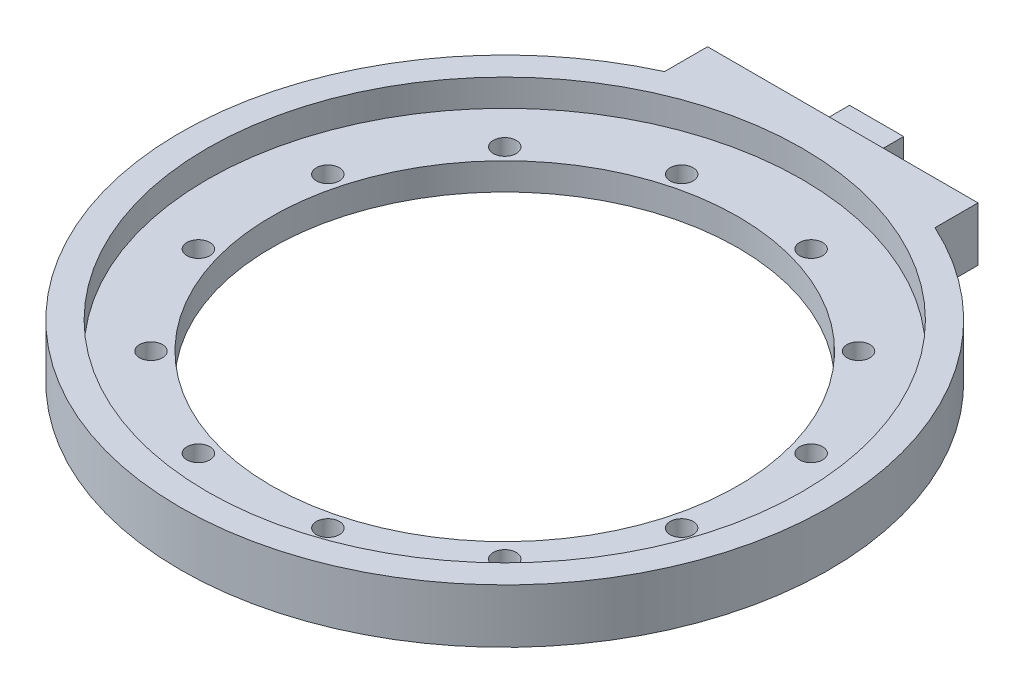
ISO-10303-21;
HEADER;
FILE_DESCRIPTION(('STEP AP214'),'2;1');
FILE_NAME('part.step','',(''),(''),'','','');
FILE_SCHEMA(('AUTOMOTIVE_DESIGN { 1 0 10303 214 1 1 1 1 }'));
ENDSEC;
DATA;
#1=APPLICATION_CONTEXT('core data for automotive mechanical design processes');
#2=APPLICATION_PROTOCOL_DEFINITION('international standard','automotive_design',2000,#1);
#3=PRODUCT_CONTEXT('',#1,'mechanical');
#4=PRODUCT('Part','Part','',(#3));
#5=PRODUCT_RELATED_PRODUCT_CATEGORY('part','',(#4));
#6=PRODUCT_DEFINITION_FORMATION('','',#4);
#7=PRODUCT_DEFINITION_CONTEXT('part definition',#1,'design');
#8=PRODUCT_DEFINITION('design','',#6,#7);
#9=PRODUCT_DEFINITION_SHAPE('','',#8);
#10=(LENGTH_UNIT() NAMED_UNIT(*) SI_UNIT(.MILLI.,.METRE.));
#11=(NAMED_UNIT(*) PLANE_ANGLE_UNIT() SI_UNIT($,.RADIAN.));
#12=(NAMED_UNIT(*) SI_UNIT($,.STERADIAN.) SOLID_ANGLE_UNIT());
#13=UNCERTAINTY_MEASURE_WITH_UNIT(LENGTH_MEASURE(1.E-05),#10,'distance_accuracy_value','');
#14=(GEOMETRIC_REPRESENTATION_CONTEXT(3) GLOBAL_UNCERTAINTY_ASSIGNED_CONTEXT((#13)) GLOBAL_UNIT_ASSIGNED_CONTEXT((#10,
#11,#12)) REPRESENTATION_CONTEXT('',''));
#15=CARTESIAN_POINT('',(0.,0.,0.));
#16=DIRECTION('',(0.,0.,1.));
#17=DIRECTION('',(1.,0.,0.));
#18=AXIS2_PLACEMENT_3D('',#15,#16,#17);
#19=CARTESIAN_POINT('',(0.,26.5,54.9999999999998));
#20=DIRECTION('',(0.,-1.,0.));
#21=DIRECTION('',(0.,0.,-1.));
#22=AXIS2_PLACEMENT_3D('',#19,#20,#21);
#23=CYLINDRICAL_SURFACE('',#22,34.5);
#24=CARTESIAN_POINT('',(0.,8.7,54.9999999999998));
#25=DIRECTION('',(0.,-1.,0.));
#26=DIRECTION('',(0.,0.,-1.));
#27=AXIS2_PLACEMENT_3D('',#24,#25,#26);
#28=CIRCLE('',#27,34.5);
#29=CARTESIAN_POINT('',(0.,8.7,20.4999999999998));
#30=VERTEX_POINT('',#29);
#31=EDGE_CURVE('E171',#30,#30,#28,.T.);
#32=ORIENTED_EDGE('',*,*,#31,.T.);
#33=EDGE_LOOP('',(#32));
#34=FACE_BOUND('',#33,.T.);
#35=CARTESIAN_POINT('',(0.,12.7,54.9999999999998));
#36=DIRECTION('',(0.,1.,0.));
#37=DIRECTION('',(0.,0.,1.));
#38=AXIS2_PLACEMENT_3D('',#35,#36,#37);
#39=CIRCLE('',#38,34.5);
#40=CARTESIAN_POINT('',(0.,12.7,89.4999999999998));
#41=VERTEX_POINT('',#40);
#42=EDGE_CURVE('E257',#41,#41,#39,.F.);
#43=ORIENTED_EDGE('',*,*,#42,.F.);
#44=EDGE_LOOP('',(#43));
#45=FACE_BOUND('',#44,.T.);
#46=ADVANCED_FACE('F33',(#34,#45),#23,.F.);
#47=CARTESIAN_POINT('',(-9.57630466879277,16.7,19.2607444273042));
#48=DIRECTION('',(0.,1.,0.));
#49=DIRECTION('',(0.,0.,1.));
#50=AXIS2_PLACEMENT_3D('',#47,#48,#49);
#51=CYLINDRICAL_SURFACE('',#50,1.69999999999999);
#52=CARTESIAN_POINT('',(-9.57630466879277,8.7,19.2607444273042));
#53=DIRECTION('',(0.,1.,0.));
#54=DIRECTION('',(0.,0.,1.));
#55=AXIS2_PLACEMENT_3D('',#52,#53,#54);
#56=CIRCLE('',#55,1.69999999999999);
#57=CARTESIAN_POINT('',(-9.57630466879277,8.7,20.9607444273042));
#58=VERTEX_POINT('',#57);
#59=EDGE_CURVE('E168',#58,#58,#56,.T.);
#60=ORIENTED_EDGE('',*,*,#59,.F.);
#61=EDGE_LOOP('',(#60));
#62=FACE_BOUND('',#61,.T.);
#63=CARTESIAN_POINT('',(-9.57630466879277,12.7,19.2607444273042));
#64=DIRECTION('',(0.,1.,0.));
#65=DIRECTION('',(0.,0.,1.));
#66=AXIS2_PLACEMENT_3D('',#63,#64,#65);
#67=CIRCLE('',#66,1.69999999999999);
#68=CARTESIAN_POINT('',(-9.57630466879277,12.7,20.9607444273042));
#69=VERTEX_POINT('',#68);
#70=EDGE_CURVE('E254',#69,#69,#67,.F.);
#71=ORIENTED_EDGE('',*,*,#70,.F.);
#72=EDGE_LOOP('',(#71));
#73=FACE_BOUND('',#72,.T.);
#74=ADVANCED_FACE('F333',(#62,#73),#51,.F.);
#75=CARTESIAN_POINT('',(-35.7392555726956,16.7,64.5763046687926));
#76=DIRECTION('',(0.,1.,0.));
#77=DIRECTION('',(0.,0.,1.));
#78=AXIS2_PLACEMENT_3D('',#75,#76,#77);
#79=CYLINDRICAL_SURFACE('',#78,1.69999999999999);
#80=CARTESIAN_POINT('',(-35.7392555726956,8.7,64.5763046687926));
#81=DIRECTION('',(0.,1.,0.));
#82=DIRECTION('',(0.,0.,1.));
#83=AXIS2_PLACEMENT_3D('',#80,#81,#82);
#84=CIRCLE('',#83,1.69999999999999);
#85=CARTESIAN_POINT('',(-35.7392555726956,8.7,66.2763046687926));
#86=VERTEX_POINT('',#85);
#87=EDGE_CURVE('E172',#86,#86,#84,.T.);
#88=ORIENTED_EDGE('',*,*,#87,.F.);
#89=EDGE_LOOP('',(#88));
#90=FACE_BOUND('',#89,.T.);
#91=CARTESIAN_POINT('',(-35.7392555726956,12.7,64.5763046687926));
#92=DIRECTION('',(0.,1.,0.));
#93=DIRECTION('',(0.,0.,1.));
#94=AXIS2_PLACEMENT_3D('',#91,#92,#93);
#95=CIRCLE('',#94,1.69999999999999);
#96=CARTESIAN_POINT('',(-35.7392555726956,12.7,66.2763046687926));
#97=VERTEX_POINT('',#96);
#98=EDGE_CURVE('E251',#97,#97,#95,.F.);
#99=ORIENTED_EDGE('',*,*,#98,.F.);
#100=EDGE_LOOP('',(#99));
#101=FACE_BOUND('',#100,.T.);
#102=ADVANCED_FACE('F338',(#90,#101),#79,.F.);
#103=CARTESIAN_POINT('',(-35.7392555726957,16.7,45.4236953312071));
#104=DIRECTION('',(0.,1.,0.));
#105=DIRECTION('',(0.,0.,1.));
#106=AXIS2_PLACEMENT_3D('',#103,#104,#105);
#107=CYLINDRICAL_SURFACE('',#106,1.69999999999999);
#108=CARTESIAN_POINT('',(-35.7392555726957,8.7,45.4236953312071));
#109=DIRECTION('',(0.,1.,0.));
#110=DIRECTION('',(0.,0.,1.));
#111=AXIS2_PLACEMENT_3D('',#108,#109,#110);
#112=CIRCLE('',#111,1.69999999999999);
#113=CARTESIAN_POINT('',(-35.7392555726957,8.7,47.1236953312071));
#114=VERTEX_POINT('',#113);
#115=EDGE_CURVE('E175',#114,#114,#112,.T.);
#116=ORIENTED_EDGE('',*,*,#115,.F.);
#117=EDGE_LOOP('',(#116));
#118=FACE_BOUND('',#117,.T.);
#119=CARTESIAN_POINT('',(-35.7392555726957,12.7,45.4236953312071));
#120=DIRECTION('',(0.,1.,0.));
#121=DIRECTION('',(0.,0.,1.));
#122=AXIS2_PLACEMENT_3D('',#119,#120,#121);
#123=CIRCLE('',#122,1.69999999999999);
#124=CARTESIAN_POINT('',(-35.7392555726957,12.7,47.1236953312071));
#125=VERTEX_POINT('',#124);
#126=EDGE_CURVE('E248',#125,#125,#123,.F.);
#127=ORIENTED_EDGE('',*,*,#126,.F.);
#128=EDGE_LOOP('',(#127));
#129=FACE_BOUND('',#128,.T.);
#130=ADVANCED_FACE('F345',(#118,#129),#107,.F.);
#131=CARTESIAN_POINT('',(-26.1629509039024,16.7,28.8370490960977));
#132=DIRECTION('',(0.,1.,0.));
#133=DIRECTION('',(0.,0.,1.));
#134=AXIS2_PLACEMENT_3D('',#131,#132,#133);
#135=CYLINDRICAL_SURFACE('',#134,1.69999999999999);
#136=CARTESIAN_POINT('',(-26.1629509039024,8.7,28.8370490960977));
#137=DIRECTION('',(0.,1.,0.));
#138=DIRECTION('',(0.,0.,1.));
#139=AXIS2_PLACEMENT_3D('',#136,#137,#138);
#140=CIRCLE('',#139,1.69999999999999);
#141=CARTESIAN_POINT('',(-26.1629509039024,8.7,30.5370490960977));
#142=VERTEX_POINT('',#141);
#143=EDGE_CURVE('E178',#142,#142,#140,.T.);
#144=ORIENTED_EDGE('',*,*,#143,.F.);
#145=EDGE_LOOP('',(#144));
#146=FACE_BOUND('',#145,.T.);
#147=CARTESIAN_POINT('',(-26.1629509039024,12.7,28.8370490960977));
#148=DIRECTION('',(0.,1.,0.));
#149=DIRECTION('',(0.,0.,1.));
#150=AXIS2_PLACEMENT_3D('',#147,#148,#149);
#151=CIRCLE('',#150,1.69999999999999);
#152=CARTESIAN_POINT('',(-26.1629509039024,12.7,30.5370490960977));
#153=VERTEX_POINT('',#152);
#154=EDGE_CURVE('E245',#153,#153,#151,.F.);
#155=ORIENTED_EDGE('',*,*,#154,.F.);
#156=EDGE_LOOP('',(#155));
#157=FACE_BOUND('',#156,.T.);
#158=ADVANCED_FACE('F349',(#146,#157),#135,.F.);
#159=CARTESIAN_POINT('',(-26.1629509039019,16.7,81.1629509039024));
#160=DIRECTION('',(0.,1.,0.));
#161=DIRECTION('',(0.,0.,1.));
#162=AXIS2_PLACEMENT_3D('',#159,#160,#161);
#163=CYLINDRICAL_SURFACE('',#162,1.69999999999999);
#164=CARTESIAN_POINT('',(-26.1629509039019,8.7,81.1629509039024));
#165=DIRECTION('',(0.,1.,0.));
#166=DIRECTION('',(0.,0.,1.));
#167=AXIS2_PLACEMENT_3D('',#164,#165,#166);
#168=CIRCLE('',#167,1.69999999999999);
#169=CARTESIAN_POINT('',(-26.1629509039019,8.7,82.8629509039024));
#170=VERTEX_POINT('',#169);
#171=EDGE_CURVE('E181',#170,#170,#168,.T.);
#172=ORIENTED_EDGE('',*,*,#171,.F.);
#173=EDGE_LOOP('',(#172));
#174=FACE_BOUND('',#173,.T.);
#175=CARTESIAN_POINT('',(-26.1629509039019,12.7,81.1629509039024));
#176=DIRECTION('',(0.,1.,0.));
#177=DIRECTION('',(0.,0.,1.));
#178=AXIS2_PLACEMENT_3D('',#175,#176,#177);
#179=CIRCLE('',#178,1.69999999999999);
#180=CARTESIAN_POINT('',(-26.1629509039019,12.7,82.8629509039024));
#181=VERTEX_POINT('',#180);
#182=EDGE_CURVE('E242',#181,#181,#179,.F.);
#183=ORIENTED_EDGE('',*,*,#182,.F.);
#184=EDGE_LOOP('',(#183));
#185=FACE_BOUND('',#184,.T.);
#186=ADVANCED_FACE('F353',(#174,#185),#163,.F.);
#187=CARTESIAN_POINT('',(-9.57630466879278,16.7,90.7392555726956));
#188=DIRECTION('',(0.,1.,0.));
#189=DIRECTION('',(0.,0.,1.));
#190=AXIS2_PLACEMENT_3D('',#187,#188,#189);
#191=CYLINDRICAL_SURFACE('',#190,1.69999999999999);
#192=CARTESIAN_POINT('',(-9.57630466879278,8.7,90.7392555726956));
#193=DIRECTION('',(0.,1.,0.));
#194=DIRECTION('',(0.,0.,1.));
#195=AXIS2_PLACEMENT_3D('',#192,#193,#194);
#196=CIRCLE('',#195,1.69999999999999);
#197=CARTESIAN_POINT('',(-9.57630466879278,8.7,92.4392555726955));
#198=VERTEX_POINT('',#197);
#199=EDGE_CURVE('E184',#198,#198,#196,.T.);
#200=ORIENTED_EDGE('',*,*,#199,.F.);
#201=EDGE_LOOP('',(#200));
#202=FACE_BOUND('',#201,.T.);
#203=CARTESIAN_POINT('',(-9.57630466879278,12.7,90.7392555726956));
#204=DIRECTION('',(0.,1.,0.));
#205=DIRECTION('',(0.,0.,1.));
#206=AXIS2_PLACEMENT_3D('',#203,#204,#205);
#207=CIRCLE('',#206,1.69999999999999);
#208=CARTESIAN_POINT('',(-9.57630466879278,12.7,92.4392555726955));
#209=VERTEX_POINT('',#208);
#210=EDGE_CURVE('E239',#209,#209,#207,.F.);
#211=ORIENTED_EDGE('',*,*,#210,.F.);
#212=EDGE_LOOP('',(#211));
#213=FACE_BOUND('',#212,.T.);
#214=ADVANCED_FACE('F357',(#202,#213),#191,.F.);
#215=CARTESIAN_POINT('',(9.57630467,16.7,90.73925557));
#216=DIRECTION('',(0.,1.,0.));
#217=DIRECTION('',(0.,0.,1.));
#218=AXIS2_PLACEMENT_3D('',#215,#216,#217);
#219=CYLINDRICAL_SURFACE('',#218,1.69999999999999);
#220=CARTESIAN_POINT('',(9.57630467,8.7,90.73925557));
#221=DIRECTION('',(0.,1.,0.));
#222=DIRECTION('',(0.,0.,1.));
#223=AXIS2_PLACEMENT_3D('',#220,#221,#222);
#224=CIRCLE('',#223,1.69999999999999);
#225=CARTESIAN_POINT('',(9.57630467,8.7,92.43925557));
#226=VERTEX_POINT('',#225);
#227=EDGE_CURVE('E187',#226,#226,#224,.T.);
#228=ORIENTED_EDGE('',*,*,#227,.F.);
#229=EDGE_LOOP('',(#228));
#230=FACE_BOUND('',#229,.T.);
#231=CARTESIAN_POINT('',(9.57630467,12.7,90.73925557));
#232=DIRECTION('',(0.,1.,0.));
#233=DIRECTION('',(0.,0.,1.));
#234=AXIS2_PLACEMENT_3D('',#231,#232,#233);
#235=CIRCLE('',#234,1.69999999999999);
#236=CARTESIAN_POINT('',(9.57630467,12.7,92.43925557));
#237=VERTEX_POINT('',#236);
#238=EDGE_CURVE('E236',#237,#237,#235,.F.);
#239=ORIENTED_EDGE('',*,*,#238,.F.);
#240=EDGE_LOOP('',(#239));
#241=FACE_BOUND('',#240,.T.);
#242=ADVANCED_FACE('F361',(#230,#241),#219,.F.);
#243=CARTESIAN_POINT('',(26.6193735905557,16.7,81.6193735905552));
#244=DIRECTION('',(0.,1.,0.));
#245=DIRECTION('',(0.,0.,1.));
#246=AXIS2_PLACEMENT_3D('',#243,#244,#245);
#247=CYLINDRICAL_SURFACE('',#246,1.69999999999999);
#248=CARTESIAN_POINT('',(26.6193735905557,8.7,81.6193735905552));
#249=DIRECTION('',(0.,1.,0.));
#250=DIRECTION('',(0.,0.,1.));
#251=AXIS2_PLACEMENT_3D('',#248,#249,#250);
#252=CIRCLE('',#251,1.69999999999999);
#253=CARTESIAN_POINT('',(26.6193735905557,8.7,83.3193735905552));
#254=VERTEX_POINT('',#253);
#255=EDGE_CURVE('E190',#254,#254,#252,.T.);
#256=ORIENTED_EDGE('',*,*,#255,.F.);
#257=EDGE_LOOP('',(#256));
#258=FACE_BOUND('',#257,.T.);
#259=CARTESIAN_POINT('',(26.6193735905557,12.7,81.6193735905552));
#260=DIRECTION('',(0.,1.,0.));
#261=DIRECTION('',(0.,0.,1.));
#262=AXIS2_PLACEMENT_3D('',#259,#260,#261);
#263=CIRCLE('',#262,1.69999999999999);
#264=CARTESIAN_POINT('',(26.6193735905557,12.7,83.3193735905552));
#265=VERTEX_POINT('',#264);
#266=EDGE_CURVE('E233',#265,#265,#263,.F.);
#267=ORIENTED_EDGE('',*,*,#266,.F.);
#268=EDGE_LOOP('',(#267));
#269=FACE_BOUND('',#268,.T.);
#270=ADVANCED_FACE('F365',(#258,#269),#247,.F.);
#271=CARTESIAN_POINT('',(35.7392555726957,16.7,64.5763046687926));
#272=DIRECTION('',(0.,1.,0.));
#273=DIRECTION('',(0.,0.,1.));
#274=AXIS2_PLACEMENT_3D('',#271,#272,#273);
#275=CYLINDRICAL_SURFACE('',#274,1.69999999999999);
#276=CARTESIAN_POINT('',(35.7392555726957,8.7,64.5763046687926));
#277=DIRECTION('',(0.,1.,0.));
#278=DIRECTION('',(0.,0.,1.));
#279=AXIS2_PLACEMENT_3D('',#276,#277,#278);
#280=CIRCLE('',#279,1.69999999999999);
#281=CARTESIAN_POINT('',(35.7392555726957,8.7,66.2763046687926));
#282=VERTEX_POINT('',#281);
#283=EDGE_CURVE('E193',#282,#282,#280,.T.);
#284=ORIENTED_EDGE('',*,*,#283,.F.);
#285=EDGE_LOOP('',(#284));
#286=FACE_BOUND('',#285,.T.);
#287=CARTESIAN_POINT('',(35.7392555726957,12.7,64.5763046687926));
#288=DIRECTION('',(0.,1.,0.));
#289=DIRECTION('',(0.,0.,1.));
#290=AXIS2_PLACEMENT_3D('',#287,#288,#289);
#291=CIRCLE('',#290,1.69999999999999);
#292=CARTESIAN_POINT('',(35.7392555726957,12.7,66.2763046687926));
#293=VERTEX_POINT('',#292);
#294=EDGE_CURVE('E230',#293,#293,#291,.F.);
#295=ORIENTED_EDGE('',*,*,#294,.F.);
#296=EDGE_LOOP('',(#295));
#297=FACE_BOUND('',#296,.T.);
#298=ADVANCED_FACE('F369',(#286,#297),#275,.F.);
#299=CARTESIAN_POINT('',(35.7392555726954,16.7,45.4236953312054));
#300=DIRECTION('',(0.,1.,0.));
#301=DIRECTION('',(0.,0.,1.));
#302=AXIS2_PLACEMENT_3D('',#299,#300,#301);
#303=CYLINDRICAL_SURFACE('',#302,1.69999999999999);
#304=CARTESIAN_POINT('',(35.7392555726954,8.7,45.4236953312054));
#305=DIRECTION('',(0.,1.,0.));
#306=DIRECTION('',(0.,0.,1.));
#307=AXIS2_PLACEMENT_3D('',#304,#305,#306);
#308=CIRCLE('',#307,1.69999999999999);
#309=CARTESIAN_POINT('',(35.7392555726954,8.7,47.1236953312054));
#310=VERTEX_POINT('',#309);
#311=EDGE_CURVE('E196',#310,#310,#308,.T.);
#312=ORIENTED_EDGE('',*,*,#311,.F.);
#313=EDGE_LOOP('',(#312));
#314=FACE_BOUND('',#313,.T.);
#315=CARTESIAN_POINT('',(35.7392555726954,12.7,45.4236953312054));
#316=DIRECTION('',(0.,1.,0.));
#317=DIRECTION('',(0.,0.,1.));
#318=AXIS2_PLACEMENT_3D('',#315,#316,#317);
#319=CIRCLE('',#318,1.69999999999999);
#320=CARTESIAN_POINT('',(35.7392555726954,12.7,47.1236953312054));
#321=VERTEX_POINT('',#320);
#322=EDGE_CURVE('E218',#321,#321,#319,.F.);
#323=ORIENTED_EDGE('',*,*,#322,.F.);
#324=EDGE_LOOP('',(#323));
#325=FACE_BOUND('',#324,.T.);
#326=ADVANCED_FACE('F373',(#314,#325),#303,.F.);
#327=CARTESIAN_POINT('',(26.1629509039016,16.7,28.8370490960969));
#328=DIRECTION('',(0.,1.,0.));
#329=DIRECTION('',(0.,0.,1.));
#330=AXIS2_PLACEMENT_3D('',#327,#328,#329);
#331=CYLINDRICAL_SURFACE('',#330,1.69999999999999);
#332=CARTESIAN_POINT('',(26.1629509039016,8.7,28.8370490960969));
#333=DIRECTION('',(0.,1.,0.));
#334=DIRECTION('',(0.,0.,1.));
#335=AXIS2_PLACEMENT_3D('',#332,#333,#334);
#336=CIRCLE('',#335,1.69999999999999);
#337=CARTESIAN_POINT('',(26.1629509039016,8.7,30.5370490960969));
#338=VERTEX_POINT('',#337);
#339=EDGE_CURVE('E199',#338,#338,#336,.T.);
#340=ORIENTED_EDGE('',*,*,#339,.F.);
#341=EDGE_LOOP('',(#340));
#342=FACE_BOUND('',#341,.T.);
#343=CARTESIAN_POINT('',(26.1629509039016,12.7,28.8370490960969));
#344=DIRECTION('',(0.,1.,0.));
#345=DIRECTION('',(0.,0.,1.));
#346=AXIS2_PLACEMENT_3D('',#343,#344,#345);
#347=CIRCLE('',#346,1.69999999999999);
#348=CARTESIAN_POINT('',(26.1629509039016,12.7,30.5370490960969));
#349=VERTEX_POINT('',#348);
#350=EDGE_CURVE('E215',#349,#349,#347,.F.);
#351=ORIENTED_EDGE('',*,*,#350,.F.);
#352=EDGE_LOOP('',(#351));
#353=FACE_BOUND('',#352,.T.);
#354=ADVANCED_FACE('F210',(#342,#353),#331,.F.);
#355=CARTESIAN_POINT('',(9.57630466879279,16.7,19.2607444273042));
#356=DIRECTION('',(0.,1.,0.));
#357=DIRECTION('',(0.,0.,1.));
#358=AXIS2_PLACEMENT_3D('',#355,#356,#357);
#359=CYLINDRICAL_SURFACE('',#358,1.69999999999999);
#360=CARTESIAN_POINT('',(9.57630466879279,8.7,19.2607444273042));
#361=DIRECTION('',(0.,1.,0.));
#362=DIRECTION('',(0.,0.,1.));
#363=AXIS2_PLACEMENT_3D('',#360,#361,#362);
#364=CIRCLE('',#363,1.69999999999999);
#365=CARTESIAN_POINT('',(9.57630466879279,8.7,20.9607444273042));
#366=VERTEX_POINT('',#365);
#367=EDGE_CURVE('E144',#366,#366,#364,.T.);
#368=ORIENTED_EDGE('',*,*,#367,.F.);
#369=EDGE_LOOP('',(#368));
#370=FACE_BOUND('',#369,.T.);
#371=CARTESIAN_POINT('',(9.57630466879279,12.7,19.2607444273042));
#372=DIRECTION('',(0.,1.,0.));
#373=DIRECTION('',(0.,0.,1.));
#374=AXIS2_PLACEMENT_3D('',#371,#372,#373);
#375=CIRCLE('',#374,1.69999999999999);
#376=CARTESIAN_POINT('',(9.57630466879279,12.7,20.9607444273042));
#377=VERTEX_POINT('',#376);
#378=EDGE_CURVE('E37',#377,#377,#375,.F.);
#379=ORIENTED_EDGE('',*,*,#378,.F.);
#380=EDGE_LOOP('',(#379));
#381=FACE_BOUND('',#380,.T.);
#382=ADVANCED_FACE('F206',(#370,#381),#359,.F.);
#383=CARTESIAN_POINT('',(0.,16.7,55.));
#384=DIRECTION('',(0.,-1.,0.));
#385=DIRECTION('',(0.,0.,-1.));
#386=AXIS2_PLACEMENT_3D('',#383,#384,#385);
#387=CYLINDRICAL_SURFACE('',#386,48.);
#388=CARTESIAN_POINT('',(0.,8.7,55.));
#389=DIRECTION('',(0.,-1.,0.));
#390=DIRECTION('',(0.,0.,1.));
#391=AXIS2_PLACEMENT_3D('',#388,#389,#390);
#392=CIRCLE('',#391,48.);
#393=CARTESIAN_POINT('',(20.,8.7,11.3651515414571));
#394=VERTEX_POINT('',#393);
#395=CARTESIAN_POINT('',(-20.,8.7,11.3651515414571));
#396=VERTEX_POINT('',#395);
#397=EDGE_CURVE('E303',#394,#396,#392,.T.);
#398=ORIENTED_EDGE('',*,*,#397,.F.);
#399=DIRECTION('',(0.,-1.,0.));
#400=VECTOR('',#399,1.);
#401=CARTESIAN_POINT('',(20.,16.7,11.3651515414571));
#402=LINE('',#401,#400);
#403=CARTESIAN_POINT('',(20.,16.7,11.3651515414571));
#404=VERTEX_POINT('',#403);
#405=EDGE_CURVE('E42',#404,#394,#402,.T.);
#406=ORIENTED_EDGE('',*,*,#405,.F.);
#407=CARTESIAN_POINT('',(0.,16.7,55.));
#408=DIRECTION('',(0.,-1.,0.));
#409=DIRECTION('',(0.,0.,1.));
#410=AXIS2_PLACEMENT_3D('',#407,#408,#409);
#411=CIRCLE('',#410,48.);
#412=CARTESIAN_POINT('',(-20.,16.7,11.3651515414571));
#413=VERTEX_POINT('',#412);
#414=EDGE_CURVE('E156',#404,#413,#411,.T.);
#415=ORIENTED_EDGE('',*,*,#414,.T.);
#416=DIRECTION('',(0.,-1.,0.));
#417=VECTOR('',#416,1.);
#418=CARTESIAN_POINT('',(-20.,16.7,11.3651515414571));
#419=LINE('',#418,#417);
#420=EDGE_CURVE('E165',#413,#396,#419,.T.);
#421=ORIENTED_EDGE('',*,*,#420,.T.);
#422=EDGE_LOOP('',(#398,#406,#415,#421));
#423=FACE_BOUND('',#422,.T.);
#424=ADVANCED_FACE('F209',(#423),#387,.T.);
#425=CARTESIAN_POINT('',(0.,16.7,55.));
#426=DIRECTION('',(0.,1.,0.));
#427=DIRECTION('',(0.,0.,1.));
#428=AXIS2_PLACEMENT_3D('',#425,#426,#427);
#429=PLANE('',#428);
#430=CARTESIAN_POINT('',(0.,16.7,54.9999999999998));
#431=DIRECTION('',(0.,1.,0.));
#432=DIRECTION('',(0.,0.,1.));
#433=AXIS2_PLACEMENT_3D('',#430,#431,#432);
#434=CIRCLE('',#433,44.);
#435=CARTESIAN_POINT('',(0.,16.7,98.9999999999998));
#436=VERTEX_POINT('',#435);
#437=EDGE_CURVE('E221',#436,#436,#434,.T.);
#438=ORIENTED_EDGE('',*,*,#437,.F.);
#439=EDGE_LOOP('',(#438));
#440=FACE_BOUND('',#439,.T.);
#441=ORIENTED_EDGE('',*,*,#414,.F.);
#442=DIRECTION('',(0.,0.,1.));
#443=VECTOR('',#442,1.);
#444=CARTESIAN_POINT('',(20.,16.7,5.));
#445=LINE('',#444,#443);
#446=CARTESIAN_POINT('',(20.,16.7,5.));
#447=VERTEX_POINT('',#446);
#448=EDGE_CURVE('E167',#447,#404,#445,.T.);
#449=ORIENTED_EDGE('',*,*,#448,.F.);
#450=DIRECTION('',(1.,0.,0.));
#451=VECTOR('',#450,1.);
#452=CARTESIAN_POINT('',(-20.,16.7,5.));
#453=LINE('',#452,#451);
#454=CARTESIAN_POINT('',(-20.,16.7,5.));
#455=VERTEX_POINT('',#454);
#456=EDGE_CURVE('E11',#455,#447,#453,.T.);
#457=ORIENTED_EDGE('',*,*,#456,.F.);
#458=DIRECTION('',(0.,0.,-1.));
#459=VECTOR('',#458,1.);
#460=CARTESIAN_POINT('',(-20.,16.7,5.));
#461=LINE('',#460,#459);
#462=EDGE_CURVE('E306',#413,#455,#461,.T.);
#463=ORIENTED_EDGE('',*,*,#462,.F.);
#464=EDGE_LOOP('',(#441,#449,#457,#463));
#465=FACE_BOUND('',#464,.T.);
#466=ADVANCED_FACE('F321',(#440,#465),#429,.T.);
#467=CARTESIAN_POINT('',(0.,8.7,55.));
#468=DIRECTION('',(0.,1.,0.));
#469=DIRECTION('',(0.,0.,1.));
#470=AXIS2_PLACEMENT_3D('',#467,#468,#469);
#471=PLANE('',#470);
#472=ORIENTED_EDGE('',*,*,#367,.T.);
#473=EDGE_LOOP('',(#472));
#474=FACE_BOUND('',#473,.T.);
#475=ORIENTED_EDGE('',*,*,#339,.T.);
#476=EDGE_LOOP('',(#475));
#477=FACE_BOUND('',#476,.T.);
#478=ORIENTED_EDGE('',*,*,#311,.T.);
#479=EDGE_LOOP('',(#478));
#480=FACE_BOUND('',#479,.T.);
#481=ORIENTED_EDGE('',*,*,#283,.T.);
#482=EDGE_LOOP('',(#481));
#483=FACE_BOUND('',#482,.T.);
#484=ORIENTED_EDGE('',*,*,#255,.T.);
#485=EDGE_LOOP('',(#484));
#486=FACE_BOUND('',#485,.T.);
#487=ORIENTED_EDGE('',*,*,#227,.T.);
#488=EDGE_LOOP('',(#487));
#489=FACE_BOUND('',#488,.T.);
#490=ORIENTED_EDGE('',*,*,#199,.T.);
#491=EDGE_LOOP('',(#490));
#492=FACE_BOUND('',#491,.T.);
#493=ORIENTED_EDGE('',*,*,#171,.T.);
#494=EDGE_LOOP('',(#493));
#495=FACE_BOUND('',#494,.T.);
#496=ORIENTED_EDGE('',*,*,#143,.T.);
#497=EDGE_LOOP('',(#496));
#498=FACE_BOUND('',#497,.T.);
#499=ORIENTED_EDGE('',*,*,#115,.T.);
#500=EDGE_LOOP('',(#499));
#501=FACE_BOUND('',#500,.T.);
#502=ORIENTED_EDGE('',*,*,#87,.T.);
#503=EDGE_LOOP('',(#502));
#504=FACE_BOUND('',#503,.T.);
#505=ORIENTED_EDGE('',*,*,#59,.T.);
#506=EDGE_LOOP('',(#505));
#507=FACE_BOUND('',#506,.T.);
#508=ORIENTED_EDGE('',*,*,#31,.F.);
#509=EDGE_LOOP('',(#508));
#510=FACE_BOUND('',#509,.T.);
#511=ORIENTED_EDGE('',*,*,#397,.T.);
#512=DIRECTION('',(0.,0.,-1.));
#513=VECTOR('',#512,1.);
#514=CARTESIAN_POINT('',(-20.,8.7,5.));
#515=LINE('',#514,#513);
#516=CARTESIAN_POINT('',(-20.,8.7,5.));
#517=VERTEX_POINT('',#516);
#518=EDGE_CURVE('E151',#396,#517,#515,.T.);
#519=ORIENTED_EDGE('',*,*,#518,.T.);
#520=DIRECTION('',(1.,0.,0.));
#521=VECTOR('',#520,1.);
#522=CARTESIAN_POINT('',(-20.,8.7,5.));
#523=LINE('',#522,#521);
#524=CARTESIAN_POINT('',(-12.,8.7,5.));
#525=VERTEX_POINT('',#524);
#526=EDGE_CURVE('E126',#517,#525,#523,.T.);
#527=ORIENTED_EDGE('',*,*,#526,.T.);
#528=DIRECTION('',(0.,0.,-1.));
#529=VECTOR('',#528,1.);
#530=CARTESIAN_POINT('',(-12.,8.7,5.));
#531=LINE('',#530,#529);
#532=CARTESIAN_POINT('',(-12.,8.7,0.));
#533=VERTEX_POINT('',#532);
#534=EDGE_CURVE('E137',#525,#533,#531,.T.);
#535=ORIENTED_EDGE('',*,*,#534,.T.);
#536=DIRECTION('',(1.,0.,0.));
#537=VECTOR('',#536,1.);
#538=CARTESIAN_POINT('',(12.,8.7,0.));
#539=LINE('',#538,#537);
#540=CARTESIAN_POINT('',(12.,8.7,0.));
#541=VERTEX_POINT('',#540);
#542=EDGE_CURVE('E272',#533,#541,#539,.T.);
#543=ORIENTED_EDGE('',*,*,#542,.T.);
#544=DIRECTION('',(0.,0.,-1.));
#545=VECTOR('',#544,1.);
#546=CARTESIAN_POINT('',(12.,8.7,5.));
#547=LINE('',#546,#545);
#548=CARTESIAN_POINT('',(12.,8.7,5.));
#549=VERTEX_POINT('',#548);
#550=EDGE_CURVE('E145',#549,#541,#547,.T.);
#551=ORIENTED_EDGE('',*,*,#550,.F.);
#552=CARTESIAN_POINT('',(20.,8.7,5.));
#553=VERTEX_POINT('',#552);
#554=EDGE_CURVE('E153',#549,#553,#523,.T.);
#555=ORIENTED_EDGE('',*,*,#554,.T.);
#556=DIRECTION('',(0.,0.,1.));
#557=VECTOR('',#556,1.);
#558=CARTESIAN_POINT('',(20.,8.7,5.));
#559=LINE('',#558,#557);
#560=EDGE_CURVE('E152',#553,#394,#559,.T.);
#561=ORIENTED_EDGE('',*,*,#560,.T.);
#562=EDGE_LOOP('',(#511,#519,#527,#535,#543,#551,#555,#561));
#563=FACE_BOUND('',#562,.T.);
#564=ADVANCED_FACE('F149',(#474,#477,#480,#483,#486,#489,#492,#495,#498,#501,#504,#507,#510,
#563),#471,.F.);
#565=CARTESIAN_POINT('',(-20.,16.7,5.));
#566=DIRECTION('',(-1.,0.,0.));
#567=DIRECTION('',(0.,0.,1.));
#568=AXIS2_PLACEMENT_3D('',#565,#566,#567);
#569=PLANE('',#568);
#570=ORIENTED_EDGE('',*,*,#518,.F.);
#571=ORIENTED_EDGE('',*,*,#420,.F.);
#572=ORIENTED_EDGE('',*,*,#462,.T.);
#573=DIRECTION('',(0.,-1.,0.));
#574=VECTOR('',#573,1.);
#575=CARTESIAN_POINT('',(-20.,16.7,5.));
#576=LINE('',#575,#574);
#577=EDGE_CURVE('E163',#455,#517,#576,.T.);
#578=ORIENTED_EDGE('',*,*,#577,.T.);
#579=EDGE_LOOP('',(#570,#571,#572,#578));
#580=FACE_BOUND('',#579,.T.);
#581=ADVANCED_FACE('F316',(#580),#569,.T.);
#582=CARTESIAN_POINT('',(20.,16.7,5.));
#583=DIRECTION('',(1.,0.,0.));
#584=DIRECTION('',(0.,0.,-1.));
#585=AXIS2_PLACEMENT_3D('',#582,#583,#584);
#586=PLANE('',#585);
#587=ORIENTED_EDGE('',*,*,#560,.F.);
#588=DIRECTION('',(0.,-1.,0.));
#589=VECTOR('',#588,1.);
#590=CARTESIAN_POINT('',(20.,16.7,5.));
#591=LINE('',#590,#589);
#592=EDGE_CURVE('E57',#447,#553,#591,.T.);
#593=ORIENTED_EDGE('',*,*,#592,.F.);
#594=ORIENTED_EDGE('',*,*,#448,.T.);
#595=ORIENTED_EDGE('',*,*,#405,.T.);
#596=EDGE_LOOP('',(#587,#593,#594,#595));
#597=FACE_BOUND('',#596,.T.);
#598=ADVANCED_FACE('F320',(#597),#586,.T.);
#599=CARTESIAN_POINT('',(-20.,16.7,5.));
#600=DIRECTION('',(0.,0.,-1.));
#601=DIRECTION('',(-1.,0.,0.));
#602=AXIS2_PLACEMENT_3D('',#599,#600,#601);
#603=PLANE('',#602);
#604=ORIENTED_EDGE('',*,*,#577,.F.);
#605=ORIENTED_EDGE('',*,*,#456,.T.);
#606=ORIENTED_EDGE('',*,*,#592,.T.);
#607=ORIENTED_EDGE('',*,*,#554,.F.);
#608=DIRECTION('',(0.,1.,0.));
#609=VECTOR('',#608,1.);
#610=CARTESIAN_POINT('',(12.,11.7,5.));
#611=LINE('',#610,#609);
#612=CARTESIAN_POINT('',(12.,11.7,5.));
#613=VERTEX_POINT('',#612);
#614=EDGE_CURVE('E133',#549,#613,#611,.T.);
#615=ORIENTED_EDGE('',*,*,#614,.T.);
#616=DIRECTION('',(-1.,0.,0.));
#617=VECTOR('',#616,1.);
#618=CARTESIAN_POINT('',(4.,11.7,5.));
#619=LINE('',#618,#617);
#620=CARTESIAN_POINT('',(4.,11.7,5.));
#621=VERTEX_POINT('',#620);
#622=EDGE_CURVE('E261',#613,#621,#619,.T.);
#623=ORIENTED_EDGE('',*,*,#622,.T.);
#624=DIRECTION('',(0.,1.,0.));
#625=VECTOR('',#624,1.);
#626=CARTESIAN_POINT('',(4.,14.7,5.));
#627=LINE('',#626,#625);
#628=CARTESIAN_POINT('',(4.,14.7,5.));
#629=VERTEX_POINT('',#628);
#630=EDGE_CURVE('E263',#621,#629,#627,.T.);
#631=ORIENTED_EDGE('',*,*,#630,.T.);
#632=DIRECTION('',(-1.,0.,0.));
#633=VECTOR('',#632,1.);
#634=CARTESIAN_POINT('',(-4.,14.7,5.));
#635=LINE('',#634,#633);
#636=CARTESIAN_POINT('',(-4.,14.7,5.));
#637=VERTEX_POINT('',#636);
#638=EDGE_CURVE('E265',#629,#637,#635,.T.);
#639=ORIENTED_EDGE('',*,*,#638,.T.);
#640=DIRECTION('',(0.,-1.,0.));
#641=VECTOR('',#640,1.);
#642=CARTESIAN_POINT('',(-4.,14.7,5.));
#643=LINE('',#642,#641);
#644=CARTESIAN_POINT('',(-4.,11.7,5.));
#645=VERTEX_POINT('',#644);
#646=EDGE_CURVE('E267',#637,#645,#643,.T.);
#647=ORIENTED_EDGE('',*,*,#646,.T.);
#648=DIRECTION('',(-1.,0.,0.));
#649=VECTOR('',#648,1.);
#650=CARTESIAN_POINT('',(-4.,11.7,5.));
#651=LINE('',#650,#649);
#652=CARTESIAN_POINT('',(-12.,11.7,5.));
#653=VERTEX_POINT('',#652);
#654=EDGE_CURVE('E130',#645,#653,#651,.T.);
#655=ORIENTED_EDGE('',*,*,#654,.T.);
#656=DIRECTION('',(0.,-1.,0.));
#657=VECTOR('',#656,1.);
#658=CARTESIAN_POINT('',(-12.,11.7,5.));
#659=LINE('',#658,#657);
#660=EDGE_CURVE('E121',#653,#525,#659,.T.);
#661=ORIENTED_EDGE('',*,*,#660,.T.);
#662=ORIENTED_EDGE('',*,*,#526,.F.);
#663=EDGE_LOOP('',(#604,#605,#606,#607,#615,#623,#631,#639,#647,#655,#661,#662));
#664=FACE_BOUND('',#663,.T.);
#665=ADVANCED_FACE('F124',(#664),#603,.T.);
#666=CARTESIAN_POINT('',(-12.,11.7,5.));
#667=DIRECTION('',(1.,0.,0.));
#668=DIRECTION('',(0.,0.,-1.));
#669=AXIS2_PLACEMENT_3D('',#666,#667,#668);
#670=PLANE('',#669);
#671=DIRECTION('',(0.,-1.,0.));
#672=VECTOR('',#671,1.);
#673=CARTESIAN_POINT('',(-12.,11.7,0.));
#674=LINE('',#673,#672);
#675=CARTESIAN_POINT('',(-12.,11.7,0.));
#676=VERTEX_POINT('',#675);
#677=EDGE_CURVE('E140',#676,#533,#674,.T.);
#678=ORIENTED_EDGE('',*,*,#677,.T.);
#679=ORIENTED_EDGE('',*,*,#534,.F.);
#680=ORIENTED_EDGE('',*,*,#660,.F.);
#681=DIRECTION('',(0.,0.,-1.));
#682=VECTOR('',#681,1.);
#683=CARTESIAN_POINT('',(-12.,11.7,5.));
#684=LINE('',#683,#682);
#685=EDGE_CURVE('E270',#653,#676,#684,.T.);
#686=ORIENTED_EDGE('',*,*,#685,.T.);
#687=EDGE_LOOP('',(#678,#679,#680,#686));
#688=FACE_BOUND('',#687,.T.);
#689=ADVANCED_FACE('F138',(#688),#670,.F.);
#690=CARTESIAN_POINT('',(12.,11.7,5.));
#691=DIRECTION('',(-1.,0.,0.));
#692=DIRECTION('',(0.,0.,1.));
#693=AXIS2_PLACEMENT_3D('',#690,#691,#692);
#694=PLANE('',#693);
#695=DIRECTION('',(0.,1.,0.));
#696=VECTOR('',#695,1.);
#697=CARTESIAN_POINT('',(12.,11.7,0.));
#698=LINE('',#697,#696);
#699=CARTESIAN_POINT('',(12.,11.7,0.));
#700=VERTEX_POINT('',#699);
#701=EDGE_CURVE('E274',#541,#700,#698,.T.);
#702=ORIENTED_EDGE('',*,*,#701,.T.);
#703=DIRECTION('',(0.,0.,-1.));
#704=VECTOR('',#703,1.);
#705=CARTESIAN_POINT('',(12.,11.7,5.));
#706=LINE('',#705,#704);
#707=EDGE_CURVE('E298',#613,#700,#706,.T.);
#708=ORIENTED_EDGE('',*,*,#707,.F.);
#709=ORIENTED_EDGE('',*,*,#614,.F.);
#710=ORIENTED_EDGE('',*,*,#550,.T.);
#711=EDGE_LOOP('',(#702,#708,#709,#710));
#712=FACE_BOUND('',#711,.T.);
#713=ADVANCED_FACE('F383',(#712),#694,.F.);
#714=CARTESIAN_POINT('',(4.,11.7,5.));
#715=DIRECTION('',(0.,-1.,0.));
#716=DIRECTION('',(0.,0.,-1.));
#717=AXIS2_PLACEMENT_3D('',#714,#715,#716);
#718=PLANE('',#717);
#719=DIRECTION('',(-1.,0.,0.));
#720=VECTOR('',#719,1.);
#721=CARTESIAN_POINT('',(4.,11.7,0.));
#722=LINE('',#721,#720);
#723=CARTESIAN_POINT('',(4.,11.7,0.));
#724=VERTEX_POINT('',#723);
#725=EDGE_CURVE('E277',#700,#724,#722,.T.);
#726=ORIENTED_EDGE('',*,*,#725,.T.);
#727=DIRECTION('',(0.,0.,-1.));
#728=VECTOR('',#727,1.);
#729=CARTESIAN_POINT('',(4.,11.7,5.));
#730=LINE('',#729,#728);
#731=EDGE_CURVE('E296',#621,#724,#730,.T.);
#732=ORIENTED_EDGE('',*,*,#731,.F.);
#733=ORIENTED_EDGE('',*,*,#622,.F.);
#734=ORIENTED_EDGE('',*,*,#707,.T.);
#735=EDGE_LOOP('',(#726,#732,#733,#734));
#736=FACE_BOUND('',#735,.T.);
#737=ADVANCED_FACE('F386',(#736),#718,.F.);
#738=CARTESIAN_POINT('',(4.,14.7,5.));
#739=DIRECTION('',(-1.,0.,0.));
#740=DIRECTION('',(0.,0.,1.));
#741=AXIS2_PLACEMENT_3D('',#738,#739,#740);
#742=PLANE('',#741);
#743=DIRECTION('',(0.,1.,0.));
#744=VECTOR('',#743,1.);
#745=CARTESIAN_POINT('',(4.,14.7,0.));
#746=LINE('',#745,#744);
#747=CARTESIAN_POINT('',(4.,14.7,0.));
#748=VERTEX_POINT('',#747);
#749=EDGE_CURVE('E280',#724,#748,#746,.T.);
#750=ORIENTED_EDGE('',*,*,#749,.T.);
#751=DIRECTION('',(0.,0.,-1.));
#752=VECTOR('',#751,1.);
#753=CARTESIAN_POINT('',(4.,14.7,5.));
#754=LINE('',#753,#752);
#755=EDGE_CURVE('E294',#629,#748,#754,.T.);
#756=ORIENTED_EDGE('',*,*,#755,.F.);
#757=ORIENTED_EDGE('',*,*,#630,.F.);
#758=ORIENTED_EDGE('',*,*,#731,.T.);
#759=EDGE_LOOP('',(#750,#756,#757,#758));
#760=FACE_BOUND('',#759,.T.);
#761=ADVANCED_FACE('F390',(#760),#742,.F.);
#762=CARTESIAN_POINT('',(-4.,14.7,5.));
#763=DIRECTION('',(0.,-1.,0.));
#764=DIRECTION('',(0.,0.,-1.));
#765=AXIS2_PLACEMENT_3D('',#762,#763,#764);
#766=PLANE('',#765);
#767=DIRECTION('',(-1.,0.,0.));
#768=VECTOR('',#767,1.);
#769=CARTESIAN_POINT('',(-4.,14.7,0.));
#770=LINE('',#769,#768);
#771=CARTESIAN_POINT('',(-4.,14.7,0.));
#772=VERTEX_POINT('',#771);
#773=EDGE_CURVE('E283',#748,#772,#770,.T.);
#774=ORIENTED_EDGE('',*,*,#773,.T.);
#775=DIRECTION('',(0.,0.,-1.));
#776=VECTOR('',#775,1.);
#777=CARTESIAN_POINT('',(-4.,14.7,5.));
#778=LINE('',#777,#776);
#779=EDGE_CURVE('E292',#637,#772,#778,.T.);
#780=ORIENTED_EDGE('',*,*,#779,.F.);
#781=ORIENTED_EDGE('',*,*,#638,.F.);
#782=ORIENTED_EDGE('',*,*,#755,.T.);
#783=EDGE_LOOP('',(#774,#780,#781,#782));
#784=FACE_BOUND('',#783,.T.);
#785=ADVANCED_FACE('F394',(#784),#766,.F.);
#786=CARTESIAN_POINT('',(-4.,14.7,5.));
#787=DIRECTION('',(1.,0.,0.));
#788=DIRECTION('',(0.,0.,-1.));
#789=AXIS2_PLACEMENT_3D('',#786,#787,#788);
#790=PLANE('',#789);
#791=DIRECTION('',(0.,-1.,0.));
#792=VECTOR('',#791,1.);
#793=CARTESIAN_POINT('',(-4.,14.7,0.));
#794=LINE('',#793,#792);
#795=CARTESIAN_POINT('',(-4.,11.7,0.));
#796=VERTEX_POINT('',#795);
#797=EDGE_CURVE('E50',#772,#796,#794,.T.);
#798=ORIENTED_EDGE('',*,*,#797,.T.);
#799=DIRECTION('',(0.,0.,-1.));
#800=VECTOR('',#799,1.);
#801=CARTESIAN_POINT('',(-4.,11.7,5.));
#802=LINE('',#801,#800);
#803=EDGE_CURVE('E290',#645,#796,#802,.T.);
#804=ORIENTED_EDGE('',*,*,#803,.F.);
#805=ORIENTED_EDGE('',*,*,#646,.F.);
#806=ORIENTED_EDGE('',*,*,#779,.T.);
#807=EDGE_LOOP('',(#798,#804,#805,#806));
#808=FACE_BOUND('',#807,.T.);
#809=ADVANCED_FACE('F398',(#808),#790,.F.);
#810=CARTESIAN_POINT('',(-4.,11.7,5.));
#811=DIRECTION('',(0.,-1.,0.));
#812=DIRECTION('',(0.,0.,-1.));
#813=AXIS2_PLACEMENT_3D('',#810,#811,#812);
#814=PLANE('',#813);
#815=DIRECTION('',(-1.,0.,0.));
#816=VECTOR('',#815,1.);
#817=CARTESIAN_POINT('',(-4.,11.7,0.));
#818=LINE('',#817,#816);
#819=EDGE_CURVE('E134',#796,#676,#818,.T.);
#820=ORIENTED_EDGE('',*,*,#819,.T.);
#821=ORIENTED_EDGE('',*,*,#685,.F.);
#822=ORIENTED_EDGE('',*,*,#654,.F.);
#823=ORIENTED_EDGE('',*,*,#803,.T.);
#824=EDGE_LOOP('',(#820,#821,#822,#823));
#825=FACE_BOUND('',#824,.T.);
#826=ADVANCED_FACE('F402',(#825),#814,.F.);
#827=CARTESIAN_POINT('',(0.,0.,0.));
#828=DIRECTION('',(0.,0.,1.));
#829=DIRECTION('',(1.,0.,0.));
#830=AXIS2_PLACEMENT_3D('',#827,#828,#829);
#831=PLANE('',#830);
#832=ORIENTED_EDGE('',*,*,#542,.F.);
#833=ORIENTED_EDGE('',*,*,#677,.F.);
#834=ORIENTED_EDGE('',*,*,#819,.F.);
#835=ORIENTED_EDGE('',*,*,#797,.F.);
#836=ORIENTED_EDGE('',*,*,#773,.F.);
#837=ORIENTED_EDGE('',*,*,#749,.F.);
#838=ORIENTED_EDGE('',*,*,#725,.F.);
#839=ORIENTED_EDGE('',*,*,#701,.F.);
#840=EDGE_LOOP('',(#832,#833,#834,#835,#836,#837,#838,#839));
#841=FACE_BOUND('',#840,.T.);
#842=ADVANCED_FACE('F35',(#841),#831,.F.);
#843=CARTESIAN_POINT('',(0.,12.7,54.9999999999998));
#844=DIRECTION('',(0.,1.,0.));
#845=DIRECTION('',(0.,0.,1.));
#846=AXIS2_PLACEMENT_3D('',#843,#844,#845);
#847=PLANE('',#846);
#848=CARTESIAN_POINT('',(0.,12.7,54.9999999999998));
#849=DIRECTION('',(0.,1.,0.));
#850=DIRECTION('',(0.,0.,1.));
#851=AXIS2_PLACEMENT_3D('',#848,#849,#850);
#852=CIRCLE('',#851,44.);
#853=CARTESIAN_POINT('',(0.,12.7,98.9999999999998));
#854=VERTEX_POINT('',#853);
#855=EDGE_CURVE('E216',#854,#854,#852,.T.);
#856=ORIENTED_EDGE('',*,*,#855,.T.);
#857=EDGE_LOOP('',(#856));
#858=FACE_BOUND('',#857,.T.);
#859=ORIENTED_EDGE('',*,*,#378,.T.);
#860=EDGE_LOOP('',(#859));
#861=FACE_BOUND('',#860,.T.);
#862=ORIENTED_EDGE('',*,*,#350,.T.);
#863=EDGE_LOOP('',(#862));
#864=FACE_BOUND('',#863,.T.);
#865=ORIENTED_EDGE('',*,*,#322,.T.);
#866=EDGE_LOOP('',(#865));
#867=FACE_BOUND('',#866,.T.);
#868=ORIENTED_EDGE('',*,*,#294,.T.);
#869=EDGE_LOOP('',(#868));
#870=FACE_BOUND('',#869,.T.);
#871=ORIENTED_EDGE('',*,*,#266,.T.);
#872=EDGE_LOOP('',(#871));
#873=FACE_BOUND('',#872,.T.);
#874=ORIENTED_EDGE('',*,*,#238,.T.);
#875=EDGE_LOOP('',(#874));
#876=FACE_BOUND('',#875,.T.);
#877=ORIENTED_EDGE('',*,*,#210,.T.);
#878=EDGE_LOOP('',(#877));
#879=FACE_BOUND('',#878,.T.);
#880=ORIENTED_EDGE('',*,*,#182,.T.);
#881=EDGE_LOOP('',(#880));
#882=FACE_BOUND('',#881,.T.);
#883=ORIENTED_EDGE('',*,*,#154,.T.);
#884=EDGE_LOOP('',(#883));
#885=FACE_BOUND('',#884,.T.);
#886=ORIENTED_EDGE('',*,*,#126,.T.);
#887=EDGE_LOOP('',(#886));
#888=FACE_BOUND('',#887,.T.);
#889=ORIENTED_EDGE('',*,*,#98,.T.);
#890=EDGE_LOOP('',(#889));
#891=FACE_BOUND('',#890,.T.);
#892=ORIENTED_EDGE('',*,*,#70,.T.);
#893=EDGE_LOOP('',(#892));
#894=FACE_BOUND('',#893,.T.);
#895=ORIENTED_EDGE('',*,*,#42,.T.);
#896=EDGE_LOOP('',(#895));
#897=FACE_BOUND('',#896,.T.);
#898=ADVANCED_FACE('F409',(#858,#861,#864,#867,#870,#873,#876,#879,#882,#885,#888,#891,#894,
#897),#847,.T.);
#899=CARTESIAN_POINT('',(0.,12.7,54.9999999999998));
#900=DIRECTION('',(0.,1.,0.));
#901=DIRECTION('',(0.,0.,1.));
#902=AXIS2_PLACEMENT_3D('',#899,#900,#901);
#903=CYLINDRICAL_SURFACE('',#902,44.);
#904=ORIENTED_EDGE('',*,*,#855,.F.);
#905=EDGE_LOOP('',(#904));
#906=FACE_BOUND('',#905,.T.);
#907=ORIENTED_EDGE('',*,*,#437,.T.);
#908=EDGE_LOOP('',(#907));
#909=FACE_BOUND('',#908,.T.);
#910=ADVANCED_FACE('F406',(#906,#909),#903,.F.);
#911=CLOSED_SHELL('',(#46,#74,#102,#130,#158,#186,#214,#242,#270,#298,#326,#354,#382,#424,#466,
#564,#581,#598,#665,#689,#713,#737,#761,#785,#809,#826,#842,#898,#910));
#912=MANIFOLD_SOLID_BREP('B2',#911);
#913=ADVANCED_BREP_SHAPE_REPRESENTATION('',(#18,#912),#14);
#914=SHAPE_DEFINITION_REPRESENTATION(#9,#913);
ENDSEC;
END-ISO-10303-21;
